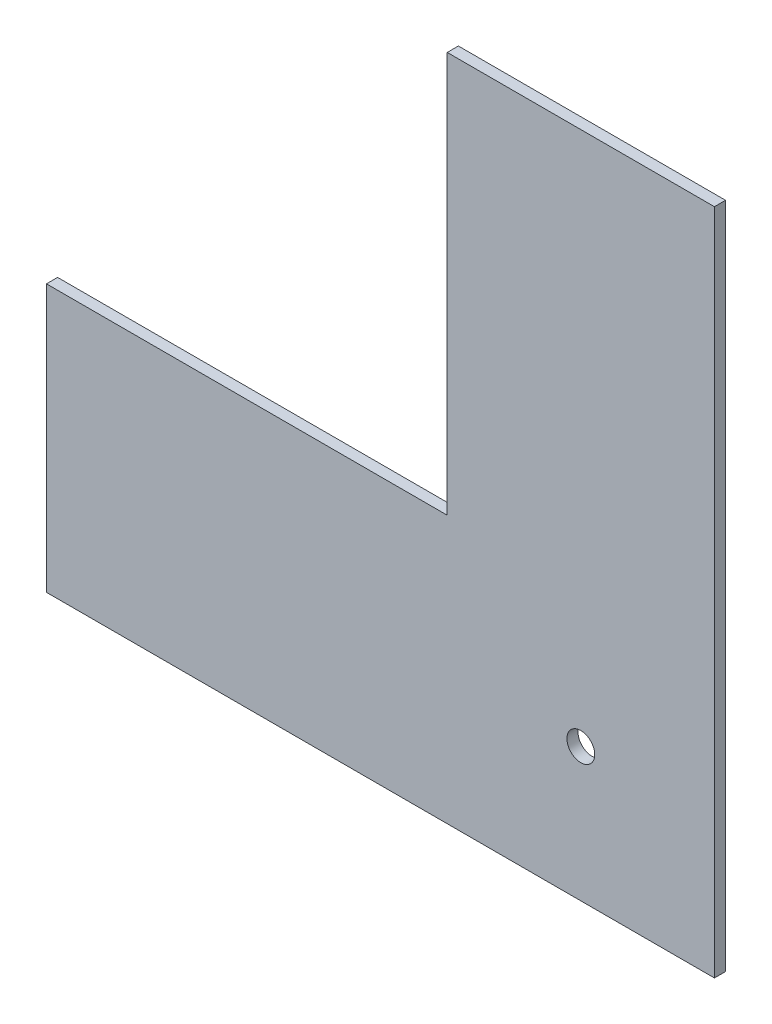
ISO-10303-21;
HEADER;
FILE_DESCRIPTION(('STEP AP214'),'2;1');
FILE_NAME('part.step','',(''),(''),'','','');
FILE_SCHEMA(('AUTOMOTIVE_DESIGN { 1 0 10303 214 1 1 1 1 }'));
ENDSEC;
DATA;
#1=APPLICATION_CONTEXT('core data for automotive mechanical design processes');
#2=APPLICATION_PROTOCOL_DEFINITION('international standard','automotive_design',2000,#1);
#3=PRODUCT_CONTEXT('',#1,'mechanical');
#4=PRODUCT('Part','Part','',(#3));
#5=PRODUCT_RELATED_PRODUCT_CATEGORY('part','',(#4));
#6=PRODUCT_DEFINITION_FORMATION('','',#4);
#7=PRODUCT_DEFINITION_CONTEXT('part definition',#1,'design');
#8=PRODUCT_DEFINITION('design','',#6,#7);
#9=PRODUCT_DEFINITION_SHAPE('','',#8);
#10=(LENGTH_UNIT() NAMED_UNIT(*) SI_UNIT(.MILLI.,.METRE.));
#11=(NAMED_UNIT(*) PLANE_ANGLE_UNIT() SI_UNIT($,.RADIAN.));
#12=(NAMED_UNIT(*) SI_UNIT($,.STERADIAN.) SOLID_ANGLE_UNIT());
#13=UNCERTAINTY_MEASURE_WITH_UNIT(LENGTH_MEASURE(1.E-05),#10,'distance_accuracy_value','');
#14=(GEOMETRIC_REPRESENTATION_CONTEXT(3) GLOBAL_UNCERTAINTY_ASSIGNED_CONTEXT((#13)) GLOBAL_UNIT_ASSIGNED_CONTEXT((#10,
#11,#12)) REPRESENTATION_CONTEXT('',''));
#15=CARTESIAN_POINT('',(0.,0.,0.));
#16=DIRECTION('',(0.,0.,1.));
#17=DIRECTION('',(1.,0.,0.));
#18=AXIS2_PLACEMENT_3D('',#15,#16,#17);
#19=CARTESIAN_POINT('',(-14.9090909090909,-24.,1.));
#20=DIRECTION('',(1.,0.,0.));
#21=DIRECTION('',(0.,0.,-1.));
#22=AXIS2_PLACEMENT_3D('',#19,#20,#21);
#23=PLANE('',#22);
#24=DIRECTION('',(0.,-1.,0.));
#25=VECTOR('',#24,1.);
#26=CARTESIAN_POINT('',(-14.9090909090909,-24.,0.));
#27=LINE('',#26,#25);
#28=CARTESIAN_POINT('',(-14.9090909090909,0.,0.));
#29=VERTEX_POINT('',#28);
#30=CARTESIAN_POINT('',(-14.9090909090909,-24.,0.));
#31=VERTEX_POINT('',#30);
#32=EDGE_CURVE('E118',#29,#31,#27,.T.);
#33=ORIENTED_EDGE('',*,*,#32,.T.);
#34=DIRECTION('',(0.,0.,-1.));
#35=VECTOR('',#34,1.);
#36=CARTESIAN_POINT('',(-14.9090909090909,-24.,1.));
#37=LINE('',#36,#35);
#38=CARTESIAN_POINT('',(-14.9090909090909,-24.,1.));
#39=VERTEX_POINT('',#38);
#40=EDGE_CURVE('E11',#39,#31,#37,.T.);
#41=ORIENTED_EDGE('',*,*,#40,.F.);
#42=DIRECTION('',(0.,-1.,0.));
#43=VECTOR('',#42,1.);
#44=CARTESIAN_POINT('',(-14.9090909090909,-24.,1.));
#45=LINE('',#44,#43);
#46=CARTESIAN_POINT('',(-14.9090909090909,0.,1.));
#47=VERTEX_POINT('',#46);
#48=EDGE_CURVE('E129',#47,#39,#45,.T.);
#49=ORIENTED_EDGE('',*,*,#48,.F.);
#50=DIRECTION('',(0.,0.,-1.));
#51=VECTOR('',#50,1.);
#52=CARTESIAN_POINT('',(-14.9090909090909,0.,1.));
#53=LINE('',#52,#51);
#54=EDGE_CURVE('E114',#47,#29,#53,.T.);
#55=ORIENTED_EDGE('',*,*,#54,.T.);
#56=EDGE_LOOP('',(#33,#41,#49,#55));
#57=FACE_BOUND('',#56,.T.);
#58=ADVANCED_FACE('F34',(#57),#23,.F.);
#59=CARTESIAN_POINT('',(45.0909090909091,-24.,1.));
#60=DIRECTION('',(0.,1.,0.));
#61=DIRECTION('',(-1.,0.,0.));
#62=AXIS2_PLACEMENT_3D('',#59,#60,#61);
#63=PLANE('',#62);
#64=DIRECTION('',(1.,0.,0.));
#65=VECTOR('',#64,1.);
#66=CARTESIAN_POINT('',(45.0909090909091,-24.,0.));
#67=LINE('',#66,#65);
#68=CARTESIAN_POINT('',(45.0909090909091,-24.,0.));
#69=VERTEX_POINT('',#68);
#70=EDGE_CURVE('E121',#31,#69,#67,.T.);
#71=ORIENTED_EDGE('',*,*,#70,.T.);
#72=DIRECTION('',(0.,0.,-1.));
#73=VECTOR('',#72,1.);
#74=CARTESIAN_POINT('',(45.0909090909091,-24.,1.));
#75=LINE('',#74,#73);
#76=CARTESIAN_POINT('',(45.0909090909091,-24.,1.));
#77=VERTEX_POINT('',#76);
#78=EDGE_CURVE('E42',#77,#69,#75,.T.);
#79=ORIENTED_EDGE('',*,*,#78,.F.);
#80=DIRECTION('',(1.,0.,0.));
#81=VECTOR('',#80,1.);
#82=CARTESIAN_POINT('',(45.0909090909091,-24.,1.));
#83=LINE('',#82,#81);
#84=EDGE_CURVE('E87',#39,#77,#83,.T.);
#85=ORIENTED_EDGE('',*,*,#84,.F.);
#86=ORIENTED_EDGE('',*,*,#40,.T.);
#87=EDGE_LOOP('',(#71,#79,#85,#86));
#88=FACE_BOUND('',#87,.T.);
#89=ADVANCED_FACE('F154',(#88),#63,.F.);
#90=CARTESIAN_POINT('',(45.0909090909091,36.,1.));
#91=DIRECTION('',(-1.,0.,0.));
#92=DIRECTION('',(0.,-1.,0.));
#93=AXIS2_PLACEMENT_3D('',#90,#91,#92);
#94=PLANE('',#93);
#95=DIRECTION('',(0.,1.,0.));
#96=VECTOR('',#95,1.);
#97=CARTESIAN_POINT('',(45.0909090909091,36.,0.));
#98=LINE('',#97,#96);
#99=CARTESIAN_POINT('',(45.0909090909091,36.,0.));
#100=VERTEX_POINT('',#99);
#101=EDGE_CURVE('E124',#69,#100,#98,.T.);
#102=ORIENTED_EDGE('',*,*,#101,.T.);
#103=DIRECTION('',(0.,0.,-1.));
#104=VECTOR('',#103,1.);
#105=CARTESIAN_POINT('',(45.0909090909091,36.,1.));
#106=LINE('',#105,#104);
#107=CARTESIAN_POINT('',(45.0909090909091,36.,1.));
#108=VERTEX_POINT('',#107);
#109=EDGE_CURVE('E109',#108,#100,#106,.T.);
#110=ORIENTED_EDGE('',*,*,#109,.F.);
#111=DIRECTION('',(0.,1.,0.));
#112=VECTOR('',#111,1.);
#113=CARTESIAN_POINT('',(45.0909090909091,36.,1.));
#114=LINE('',#113,#112);
#115=EDGE_CURVE('E100',#77,#108,#114,.T.);
#116=ORIENTED_EDGE('',*,*,#115,.F.);
#117=ORIENTED_EDGE('',*,*,#78,.T.);
#118=EDGE_LOOP('',(#102,#110,#116,#117));
#119=FACE_BOUND('',#118,.T.);
#120=ADVANCED_FACE('F135',(#119),#94,.F.);
#121=CARTESIAN_POINT('',(21.0909090909091,36.,1.));
#122=DIRECTION('',(0.,-1.,0.));
#123=DIRECTION('',(1.,0.,0.));
#124=AXIS2_PLACEMENT_3D('',#121,#122,#123);
#125=PLANE('',#124);
#126=DIRECTION('',(-1.,0.,0.));
#127=VECTOR('',#126,1.);
#128=CARTESIAN_POINT('',(21.0909090909091,36.,0.));
#129=LINE('',#128,#127);
#130=CARTESIAN_POINT('',(21.0909090909091,36.,0.));
#131=VERTEX_POINT('',#130);
#132=EDGE_CURVE('E108',#100,#131,#129,.T.);
#133=ORIENTED_EDGE('',*,*,#132,.T.);
#134=DIRECTION('',(0.,0.,-1.));
#135=VECTOR('',#134,1.);
#136=CARTESIAN_POINT('',(21.0909090909091,36.,1.));
#137=LINE('',#136,#135);
#138=CARTESIAN_POINT('',(21.0909090909091,36.,1.));
#139=VERTEX_POINT('',#138);
#140=EDGE_CURVE('E105',#139,#131,#137,.T.);
#141=ORIENTED_EDGE('',*,*,#140,.F.);
#142=DIRECTION('',(-1.,0.,0.));
#143=VECTOR('',#142,1.);
#144=CARTESIAN_POINT('',(21.0909090909091,36.,1.));
#145=LINE('',#144,#143);
#146=EDGE_CURVE('E94',#108,#139,#145,.T.);
#147=ORIENTED_EDGE('',*,*,#146,.F.);
#148=ORIENTED_EDGE('',*,*,#109,.T.);
#149=EDGE_LOOP('',(#133,#141,#147,#148));
#150=FACE_BOUND('',#149,.T.);
#151=ADVANCED_FACE('F106',(#150),#125,.F.);
#152=CARTESIAN_POINT('',(21.0909090909091,36.,1.));
#153=DIRECTION('',(1.,0.,0.));
#154=DIRECTION('',(0.,1.,0.));
#155=AXIS2_PLACEMENT_3D('',#152,#153,#154);
#156=PLANE('',#155);
#157=DIRECTION('',(0.,-1.,0.));
#158=VECTOR('',#157,1.);
#159=CARTESIAN_POINT('',(21.0909090909091,36.,0.));
#160=LINE('',#159,#158);
#161=CARTESIAN_POINT('',(21.0909090909091,0.,0.));
#162=VERTEX_POINT('',#161);
#163=EDGE_CURVE('E73',#131,#162,#160,.T.);
#164=ORIENTED_EDGE('',*,*,#163,.T.);
#165=DIRECTION('',(0.,0.,-1.));
#166=VECTOR('',#165,1.);
#167=CARTESIAN_POINT('',(21.0909090909091,0.,1.));
#168=LINE('',#167,#166);
#169=CARTESIAN_POINT('',(21.0909090909091,0.,1.));
#170=VERTEX_POINT('',#169);
#171=EDGE_CURVE('E110',#170,#162,#168,.T.);
#172=ORIENTED_EDGE('',*,*,#171,.F.);
#173=DIRECTION('',(0.,-1.,0.));
#174=VECTOR('',#173,1.);
#175=CARTESIAN_POINT('',(21.0909090909091,36.,1.));
#176=LINE('',#175,#174);
#177=EDGE_CURVE('E98',#139,#170,#176,.T.);
#178=ORIENTED_EDGE('',*,*,#177,.F.);
#179=ORIENTED_EDGE('',*,*,#140,.T.);
#180=EDGE_LOOP('',(#164,#172,#178,#179));
#181=FACE_BOUND('',#180,.T.);
#182=ADVANCED_FACE('F112',(#181),#156,.F.);
#183=CARTESIAN_POINT('',(-14.9090909090909,0.,1.));
#184=DIRECTION('',(0.,-1.,0.));
#185=DIRECTION('',(1.,0.,0.));
#186=AXIS2_PLACEMENT_3D('',#183,#184,#185);
#187=PLANE('',#186);
#188=DIRECTION('',(-1.,0.,0.));
#189=VECTOR('',#188,1.);
#190=CARTESIAN_POINT('',(-14.9090909090909,0.,0.));
#191=LINE('',#190,#189);
#192=EDGE_CURVE('E79',#162,#29,#191,.T.);
#193=ORIENTED_EDGE('',*,*,#192,.T.);
#194=ORIENTED_EDGE('',*,*,#54,.F.);
#195=DIRECTION('',(-1.,0.,0.));
#196=VECTOR('',#195,1.);
#197=CARTESIAN_POINT('',(-14.9090909090909,0.,1.));
#198=LINE('',#197,#196);
#199=EDGE_CURVE('E50',#170,#47,#198,.T.);
#200=ORIENTED_EDGE('',*,*,#199,.F.);
#201=ORIENTED_EDGE('',*,*,#171,.T.);
#202=EDGE_LOOP('',(#193,#194,#200,#201));
#203=FACE_BOUND('',#202,.T.);
#204=ADVANCED_FACE('F142',(#203),#187,.F.);
#205=CARTESIAN_POINT('',(0.,0.,1.));
#206=DIRECTION('',(0.,0.,-1.));
#207=DIRECTION('',(-1.,0.,0.));
#208=AXIS2_PLACEMENT_3D('',#205,#206,#207);
#209=PLANE('',#208);
#210=CARTESIAN_POINT('',(33.0909090909091,-12.,1.));
#211=DIRECTION('',(0.,0.,1.));
#212=DIRECTION('',(1.,0.,0.));
#213=AXIS2_PLACEMENT_3D('',#210,#211,#212);
#214=CIRCLE('',#213,1.24999999999999);
#215=CARTESIAN_POINT('',(34.3409090909091,-12.,1.));
#216=VERTEX_POINT('',#215);
#217=EDGE_CURVE('E209',#216,#216,#214,.T.);
#218=ORIENTED_EDGE('',*,*,#217,.F.);
#219=EDGE_LOOP('',(#218));
#220=FACE_BOUND('',#219,.T.);
#221=ORIENTED_EDGE('',*,*,#48,.T.);
#222=ORIENTED_EDGE('',*,*,#84,.T.);
#223=ORIENTED_EDGE('',*,*,#115,.T.);
#224=ORIENTED_EDGE('',*,*,#146,.T.);
#225=ORIENTED_EDGE('',*,*,#177,.T.);
#226=ORIENTED_EDGE('',*,*,#199,.T.);
#227=EDGE_LOOP('',(#221,#222,#223,#224,#225,#226));
#228=FACE_BOUND('',#227,.T.);
#229=ADVANCED_FACE('F96',(#220,#228),#209,.F.);
#230=CARTESIAN_POINT('',(0.,0.,0.));
#231=DIRECTION('',(0.,0.,-1.));
#232=DIRECTION('',(-1.,0.,0.));
#233=AXIS2_PLACEMENT_3D('',#230,#231,#232);
#234=PLANE('',#233);
#235=CARTESIAN_POINT('',(33.0909090909091,-12.,0.));
#236=DIRECTION('',(0.,0.,1.));
#237=DIRECTION('',(1.,0.,0.));
#238=AXIS2_PLACEMENT_3D('',#235,#236,#237);
#239=CIRCLE('',#238,1.24999999999999);
#240=CARTESIAN_POINT('',(34.3409090909091,-12.,0.));
#241=VERTEX_POINT('',#240);
#242=EDGE_CURVE('E122',#241,#241,#239,.T.);
#243=ORIENTED_EDGE('',*,*,#242,.T.);
#244=EDGE_LOOP('',(#243));
#245=FACE_BOUND('',#244,.T.);
#246=ORIENTED_EDGE('',*,*,#32,.F.);
#247=ORIENTED_EDGE('',*,*,#192,.F.);
#248=ORIENTED_EDGE('',*,*,#163,.F.);
#249=ORIENTED_EDGE('',*,*,#132,.F.);
#250=ORIENTED_EDGE('',*,*,#101,.F.);
#251=ORIENTED_EDGE('',*,*,#70,.F.);
#252=EDGE_LOOP('',(#246,#247,#248,#249,#250,#251));
#253=FACE_BOUND('',#252,.T.);
#254=ADVANCED_FACE('F138',(#245,#253),#234,.T.);
#255=CARTESIAN_POINT('',(33.0909090909091,-12.,1.));
#256=DIRECTION('',(0.,0.,1.));
#257=DIRECTION('',(1.,0.,0.));
#258=AXIS2_PLACEMENT_3D('',#255,#256,#257);
#259=CYLINDRICAL_SURFACE('',#258,1.24999999999999);
#260=ORIENTED_EDGE('',*,*,#242,.F.);
#261=EDGE_LOOP('',(#260));
#262=FACE_BOUND('',#261,.T.);
#263=ORIENTED_EDGE('',*,*,#217,.T.);
#264=EDGE_LOOP('',(#263));
#265=FACE_BOUND('',#264,.T.);
#266=ADVANCED_FACE('F191',(#262,#265),#259,.F.);
#267=CLOSED_SHELL('',(#58,#89,#120,#151,#182,#204,#229,#254,#266));
#268=MANIFOLD_SOLID_BREP('B2',#267);
#269=ADVANCED_BREP_SHAPE_REPRESENTATION('',(#18,#268),#14);
#270=SHAPE_DEFINITION_REPRESENTATION(#9,#269);
ENDSEC;
END-ISO-10303-21;
